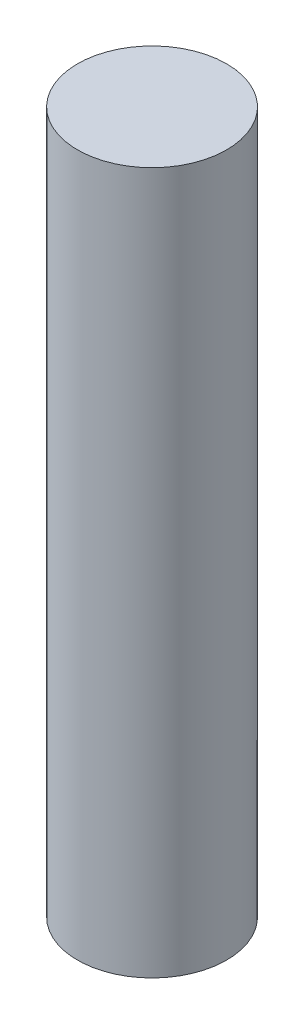
ISO-10303-21;
HEADER;
FILE_DESCRIPTION(('STEP AP214'),'2;1');
FILE_NAME('part.step','',(''),(''),'','','');
FILE_SCHEMA(('AUTOMOTIVE_DESIGN { 1 0 10303 214 1 1 1 1 }'));
ENDSEC;
DATA;
#1=APPLICATION_CONTEXT('core data for automotive mechanical design processes');
#2=APPLICATION_PROTOCOL_DEFINITION('international standard','automotive_design',2000,#1);
#3=PRODUCT_CONTEXT('',#1,'mechanical');
#4=PRODUCT('Part','Part','',(#3));
#5=PRODUCT_RELATED_PRODUCT_CATEGORY('part','',(#4));
#6=PRODUCT_DEFINITION_FORMATION('','',#4);
#7=PRODUCT_DEFINITION_CONTEXT('part definition',#1,'design');
#8=PRODUCT_DEFINITION('design','',#6,#7);
#9=PRODUCT_DEFINITION_SHAPE('','',#8);
#10=(LENGTH_UNIT() NAMED_UNIT(*) SI_UNIT(.MILLI.,.METRE.));
#11=(NAMED_UNIT(*) PLANE_ANGLE_UNIT() SI_UNIT($,.RADIAN.));
#12=(NAMED_UNIT(*) SI_UNIT($,.STERADIAN.) SOLID_ANGLE_UNIT());
#13=UNCERTAINTY_MEASURE_WITH_UNIT(LENGTH_MEASURE(1.E-05),#10,'distance_accuracy_value','');
#14=(GEOMETRIC_REPRESENTATION_CONTEXT(3) GLOBAL_UNCERTAINTY_ASSIGNED_CONTEXT((#13)) GLOBAL_UNIT_ASSIGNED_CONTEXT((#10,
#11,#12)) REPRESENTATION_CONTEXT('',''));
#15=CARTESIAN_POINT('',(0.,0.,0.));
#16=DIRECTION('',(0.,0.,1.));
#17=DIRECTION('',(1.,0.,0.));
#18=AXIS2_PLACEMENT_3D('',#15,#16,#17);
#19=CARTESIAN_POINT('',(0.,23.9,0.));
#20=DIRECTION('',(0.,-1.,0.));
#21=DIRECTION('',(0.,0.,-1.));
#22=AXIS2_PLACEMENT_3D('',#19,#20,#21);
#23=CYLINDRICAL_SURFACE('',#22,2.54);
#24=CARTESIAN_POINT('',(0.,23.9,0.));
#25=DIRECTION('',(0.,1.,0.));
#26=DIRECTION('',(0.,0.,1.));
#27=AXIS2_PLACEMENT_3D('',#24,#25,#26);
#28=CIRCLE('',#27,2.54);
#29=CARTESIAN_POINT('',(0.,23.9,-2.54));
#30=VERTEX_POINT('',#29);
#31=EDGE_CURVE('E10',#30,#30,#28,.T.);
#32=CARTESIAN_POINT('',(0.,0.,0.));
#33=DIRECTION('',(0.,1.,0.));
#34=DIRECTION('',(0.,0.,1.));
#35=AXIS2_PLACEMENT_3D('',#32,#33,#34);
#36=CIRCLE('',#35,2.54);
#37=CARTESIAN_POINT('',(0.,0.,-2.54));
#38=VERTEX_POINT('',#37);
#39=EDGE_CURVE('E34',#38,#38,#36,.T.);
#40=CARTESIAN_POINT('',(0.,23.9,-2.54));
#41=CARTESIAN_POINT('',(0.,23.6510416666667,-2.54));
#42=CARTESIAN_POINT('',(0.,23.4020833333333,-2.54));
#43=CARTESIAN_POINT('',(0.,22.9041666666667,-2.54));
#44=CARTESIAN_POINT('',(0.,22.6552083333333,-2.54));
#45=CARTESIAN_POINT('',(0.,22.1572916666667,-2.54));
#46=CARTESIAN_POINT('',(0.,21.9083333333333,-2.54));
#47=CARTESIAN_POINT('',(0.,21.4104166666667,-2.54));
#48=CARTESIAN_POINT('',(0.,21.1614583333333,-2.54));
#49=CARTESIAN_POINT('',(0.,20.6635416666667,-2.54));
#50=CARTESIAN_POINT('',(0.,20.4145833333333,-2.54));
#51=CARTESIAN_POINT('',(0.,19.9166666666667,-2.54));
#52=CARTESIAN_POINT('',(0.,19.6677083333333,-2.54));
#53=CARTESIAN_POINT('',(0.,19.1697916666667,-2.54));
#54=CARTESIAN_POINT('',(0.,18.9208333333333,-2.54));
#55=CARTESIAN_POINT('',(0.,18.4229166666667,-2.54));
#56=CARTESIAN_POINT('',(0.,18.1739583333333,-2.54));
#57=CARTESIAN_POINT('',(0.,17.6760416666667,-2.54));
#58=CARTESIAN_POINT('',(0.,17.4270833333333,-2.54));
#59=CARTESIAN_POINT('',(0.,16.9291666666667,-2.54));
#60=CARTESIAN_POINT('',(0.,16.6802083333333,-2.54));
#61=CARTESIAN_POINT('',(0.,16.1822916666667,-2.54));
#62=CARTESIAN_POINT('',(0.,15.9333333333333,-2.54));
#63=CARTESIAN_POINT('',(0.,15.4354166666667,-2.54));
#64=CARTESIAN_POINT('',(0.,15.1864583333333,-2.54));
#65=CARTESIAN_POINT('',(0.,14.6885416666667,-2.54));
#66=CARTESIAN_POINT('',(0.,14.4395833333333,-2.54));
#67=CARTESIAN_POINT('',(0.,13.9416666666667,-2.54));
#68=CARTESIAN_POINT('',(0.,13.6927083333333,-2.54));
#69=CARTESIAN_POINT('',(0.,13.1947916666667,-2.54));
#70=CARTESIAN_POINT('',(0.,12.9458333333333,-2.54));
#71=CARTESIAN_POINT('',(0.,12.4479166666667,-2.54));
#72=CARTESIAN_POINT('',(0.,12.1989583333333,-2.54));
#73=CARTESIAN_POINT('',(0.,11.7010416666667,-2.54));
#74=CARTESIAN_POINT('',(0.,11.4520833333333,-2.54));
#75=CARTESIAN_POINT('',(0.,10.9541666666667,-2.54));
#76=CARTESIAN_POINT('',(0.,10.7052083333333,-2.54));
#77=CARTESIAN_POINT('',(0.,10.2072916666667,-2.54));
#78=CARTESIAN_POINT('',(0.,9.95833333333333,-2.54));
#79=CARTESIAN_POINT('',(0.,9.46041666666666,-2.54));
#80=CARTESIAN_POINT('',(0.,9.21145833333333,-2.54));
#81=CARTESIAN_POINT('',(0.,8.71354166666666,-2.54));
#82=CARTESIAN_POINT('',(0.,8.46458333333333,-2.54));
#83=CARTESIAN_POINT('',(0.,7.96666666666667,-2.54));
#84=CARTESIAN_POINT('',(0.,7.71770833333333,-2.54));
#85=CARTESIAN_POINT('',(0.,7.21979166666667,-2.54));
#86=CARTESIAN_POINT('',(0.,6.97083333333333,-2.54));
#87=CARTESIAN_POINT('',(0.,6.47291666666666,-2.54));
#88=CARTESIAN_POINT('',(0.,6.22395833333333,-2.54));
#89=CARTESIAN_POINT('',(0.,5.72604166666666,-2.54));
#90=CARTESIAN_POINT('',(0.,5.47708333333333,-2.54));
#91=CARTESIAN_POINT('',(0.,4.97916666666666,-2.54));
#92=CARTESIAN_POINT('',(0.,4.73020833333333,-2.54));
#93=CARTESIAN_POINT('',(0.,4.23229166666666,-2.54));
#94=CARTESIAN_POINT('',(0.,3.98333333333333,-2.54));
#95=CARTESIAN_POINT('',(0.,3.48541666666666,-2.54));
#96=CARTESIAN_POINT('',(0.,3.23645833333333,-2.54));
#97=CARTESIAN_POINT('',(0.,2.73854166666666,-2.54));
#98=CARTESIAN_POINT('',(0.,2.48958333333333,-2.54));
#99=CARTESIAN_POINT('',(0.,1.99166666666666,-2.54));
#100=CARTESIAN_POINT('',(0.,1.74270833333333,-2.54));
#101=CARTESIAN_POINT('',(0.,1.24479166666666,-2.54));
#102=CARTESIAN_POINT('',(0.,0.995833333333331,-2.54));
#103=CARTESIAN_POINT('',(0.,0.497916666666664,-2.54));
#104=CARTESIAN_POINT('',(0.,0.24895833333333,-2.54));
#105=CARTESIAN_POINT('',(0.,0.,-2.54));
#106=B_SPLINE_CURVE_WITH_KNOTS('',3,(#40,#41,#42,#43,#44,#45,#46,#47,#48,#49,#50,#51,#52,#53,
#54,#55,#56,#57,#58,#59,#60,#61,#62,#63,#64,#65,#66,#67,#68,#69,#70,#71,#72,#73,#74,#75,#76,#77,
#78,#79,#80,#81,#82,#83,#84,#85,#86,#87,#88,#89,#90,#91,#92,#93,#94,#95,#96,#97,#98,#99,#100,
#101,#102,#103,#104,#105),.UNSPECIFIED.,.F.,.F.,(4,2,2,2,2,2,2,2,2,2,2,2,2,2,2,2,2,2,2,2,2,2,2,
2,2,2,2,2,2,2,2,2,4),(0.,0.746875000000001,1.49375,2.240625,2.9875,3.734375,4.48125,5.228125,
5.975,6.721875,7.46875,8.215625,8.9625,9.709375,10.45625,11.203125,11.95,12.696875,13.44375,
14.190625,14.9375,15.684375,16.43125,17.178125,17.925,18.671875,19.41875,20.165625,20.9125,
21.659375,22.40625,23.153125,23.9),.UNSPECIFIED.);
#107=EDGE_CURVE('BSEAM31',#30,#38,#106,.T.);
#108=ORIENTED_EDGE('',*,*,#31,.F.);
#109=ORIENTED_EDGE('',*,*,#39,.T.);
#110=ORIENTED_EDGE('',*,*,#107,.T.);
#111=ORIENTED_EDGE('',*,*,#107,.F.);
#112=EDGE_LOOP('',(#108,#110,#109,#111));
#113=FACE_BOUND('',#112,.T.);
#114=ADVANCED_FACE('F31',(#113),#23,.T.);
#115=CARTESIAN_POINT('',(0.,23.9,0.));
#116=DIRECTION('',(0.,1.,0.));
#117=DIRECTION('',(0.,0.,1.));
#118=AXIS2_PLACEMENT_3D('',#115,#116,#117);
#119=PLANE('',#118);
#120=ORIENTED_EDGE('',*,*,#31,.T.);
#121=EDGE_LOOP('',(#120));
#122=FACE_BOUND('',#121,.T.);
#123=ADVANCED_FACE('F46',(#122),#119,.T.);
#124=CARTESIAN_POINT('',(0.,0.,0.));
#125=DIRECTION('',(0.,1.,0.));
#126=DIRECTION('',(0.,0.,1.));
#127=AXIS2_PLACEMENT_3D('',#124,#125,#126);
#128=PLANE('',#127);
#129=ORIENTED_EDGE('',*,*,#39,.F.);
#130=EDGE_LOOP('',(#129));
#131=FACE_BOUND('',#130,.T.);
#132=ADVANCED_FACE('F44',(#131),#128,.F.);
#133=CLOSED_SHELL('',(#114,#123,#132));
#134=MANIFOLD_SOLID_BREP('B2',#133);
#135=ADVANCED_BREP_SHAPE_REPRESENTATION('',(#18,#134),#14);
#136=SHAPE_DEFINITION_REPRESENTATION(#9,#135);
ENDSEC;
END-ISO-10303-21;
